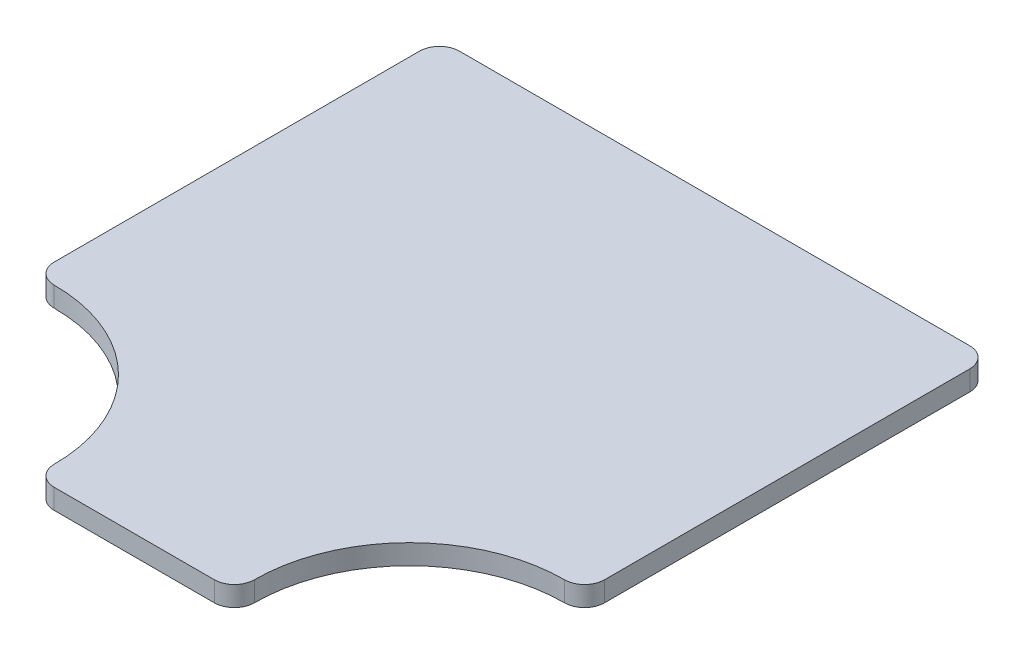
ISO-10303-21;
HEADER;
FILE_DESCRIPTION(('STEP AP214'),'2;1');
FILE_NAME('part.step','',(''),(''),'','','');
FILE_SCHEMA(('AUTOMOTIVE_DESIGN { 1 0 10303 214 1 1 1 1 }'));
ENDSEC;
DATA;
#1=APPLICATION_CONTEXT('core data for automotive mechanical design processes');
#2=APPLICATION_PROTOCOL_DEFINITION('international standard','automotive_design',2000,#1);
#3=PRODUCT_CONTEXT('',#1,'mechanical');
#4=PRODUCT('Part','Part','',(#3));
#5=PRODUCT_RELATED_PRODUCT_CATEGORY('part','',(#4));
#6=PRODUCT_DEFINITION_FORMATION('','',#4);
#7=PRODUCT_DEFINITION_CONTEXT('part definition',#1,'design');
#8=PRODUCT_DEFINITION('design','',#6,#7);
#9=PRODUCT_DEFINITION_SHAPE('','',#8);
#10=(LENGTH_UNIT() NAMED_UNIT(*) SI_UNIT(.MILLI.,.METRE.));
#11=(NAMED_UNIT(*) PLANE_ANGLE_UNIT() SI_UNIT($,.RADIAN.));
#12=(NAMED_UNIT(*) SI_UNIT($,.STERADIAN.) SOLID_ANGLE_UNIT());
#13=UNCERTAINTY_MEASURE_WITH_UNIT(LENGTH_MEASURE(1.E-05),#10,'distance_accuracy_value','');
#14=(GEOMETRIC_REPRESENTATION_CONTEXT(3) GLOBAL_UNCERTAINTY_ASSIGNED_CONTEXT((#13)) GLOBAL_UNIT_ASSIGNED_CONTEXT((#10,
#11,#12)) REPRESENTATION_CONTEXT('',''));
#15=CARTESIAN_POINT('',(0.,0.,0.));
#16=DIRECTION('',(0.,0.,1.));
#17=DIRECTION('',(1.,0.,0.));
#18=AXIS2_PLACEMENT_3D('',#15,#16,#17);
#19=CARTESIAN_POINT('',(-41.5283816425121,2.,-2.69220383256537));
#20=DIRECTION('',(0.,-1.,0.));
#21=DIRECTION('',(0.,0.,-1.));
#22=AXIS2_PLACEMENT_3D('',#19,#20,#21);
#23=CYLINDRICAL_SURFACE('',#22,2.);
#24=CARTESIAN_POINT('',(-41.5283816425121,0.,-2.69220383256537));
#25=DIRECTION('',(0.,1.,0.));
#26=DIRECTION('',(0.,0.,1.));
#27=AXIS2_PLACEMENT_3D('',#24,#25,#26);
#28=CIRCLE('',#27,2.);
#29=CARTESIAN_POINT('',(-43.5283816425121,0.,-2.69220383256537));
#30=VERTEX_POINT('',#29);
#31=CARTESIAN_POINT('',(-41.5283816425121,0.,-0.692203832565375));
#32=VERTEX_POINT('',#31);
#33=EDGE_CURVE('E152',#30,#32,#28,.T.);
#34=ORIENTED_EDGE('',*,*,#33,.T.);
#35=DIRECTION('',(0.,-1.,0.));
#36=VECTOR('',#35,1.);
#37=CARTESIAN_POINT('',(-41.5283816425121,2.,-0.692203832565375));
#38=LINE('',#37,#36);
#39=CARTESIAN_POINT('',(-41.5283816425121,2.,-0.692203832565375));
#40=VERTEX_POINT('',#39);
#41=EDGE_CURVE('E11',#40,#32,#38,.T.);
#42=ORIENTED_EDGE('',*,*,#41,.F.);
#43=CARTESIAN_POINT('',(-41.5283816425121,2.,-2.69220383256537));
#44=DIRECTION('',(0.,1.,0.));
#45=DIRECTION('',(0.,0.,1.));
#46=AXIS2_PLACEMENT_3D('',#43,#44,#45);
#47=CIRCLE('',#46,2.);
#48=CARTESIAN_POINT('',(-43.5283816425121,2.,-2.69220383256537));
#49=VERTEX_POINT('',#48);
#50=EDGE_CURVE('E174',#49,#40,#47,.T.);
#51=ORIENTED_EDGE('',*,*,#50,.F.);
#52=DIRECTION('',(0.,-1.,0.));
#53=VECTOR('',#52,1.);
#54=CARTESIAN_POINT('',(-43.5283816425121,2.,-2.69220383256537));
#55=LINE('',#54,#53);
#56=EDGE_CURVE('E148',#49,#30,#55,.T.);
#57=ORIENTED_EDGE('',*,*,#56,.T.);
#58=EDGE_LOOP('',(#34,#42,#51,#57));
#59=FACE_BOUND('',#58,.T.);
#60=ADVANCED_FACE('F32',(#59),#23,.T.);
#61=CARTESIAN_POINT('',(-41.5283816425121,2.,14.8077961674346));
#62=DIRECTION('',(0.,-1.,0.));
#63=DIRECTION('',(0.,0.,-1.));
#64=AXIS2_PLACEMENT_3D('',#61,#62,#63);
#65=CYLINDRICAL_SURFACE('',#64,15.5);
#66=CARTESIAN_POINT('',(-41.5283816425121,0.,14.8077961674346));
#67=DIRECTION('',(0.,-1.,0.));
#68=DIRECTION('',(0.,0.,1.));
#69=AXIS2_PLACEMENT_3D('',#66,#67,#68);
#70=CIRCLE('',#69,15.5);
#71=CARTESIAN_POINT('',(-26.0283816425121,0.,14.8077961674346));
#72=VERTEX_POINT('',#71);
#73=EDGE_CURVE('E155',#32,#72,#70,.T.);
#74=ORIENTED_EDGE('',*,*,#73,.T.);
#75=DIRECTION('',(0.,-1.,0.));
#76=VECTOR('',#75,1.);
#77=CARTESIAN_POINT('',(-26.0283816425121,2.,14.8077961674346));
#78=LINE('',#77,#76);
#79=CARTESIAN_POINT('',(-26.0283816425121,2.,14.8077961674346));
#80=VERTEX_POINT('',#79);
#81=EDGE_CURVE('E40',#80,#72,#78,.T.);
#82=ORIENTED_EDGE('',*,*,#81,.F.);
#83=CARTESIAN_POINT('',(-41.5283816425121,2.,14.8077961674346));
#84=DIRECTION('',(0.,-1.,0.));
#85=DIRECTION('',(0.,0.,1.));
#86=AXIS2_PLACEMENT_3D('',#83,#84,#85);
#87=CIRCLE('',#86,15.5);
#88=EDGE_CURVE('E103',#40,#80,#87,.T.);
#89=ORIENTED_EDGE('',*,*,#88,.F.);
#90=ORIENTED_EDGE('',*,*,#41,.T.);
#91=EDGE_LOOP('',(#74,#82,#89,#90));
#92=FACE_BOUND('',#91,.T.);
#93=ADVANCED_FACE('F252',(#92),#65,.F.);
#94=CARTESIAN_POINT('',(-24.0283816425121,2.,14.8077961674346));
#95=DIRECTION('',(0.,-1.,0.));
#96=DIRECTION('',(0.,0.,-1.));
#97=AXIS2_PLACEMENT_3D('',#94,#95,#96);
#98=CYLINDRICAL_SURFACE('',#97,2.);
#99=CARTESIAN_POINT('',(-24.0283816425121,0.,14.8077961674346));
#100=DIRECTION('',(0.,1.,0.));
#101=DIRECTION('',(0.,0.,1.));
#102=AXIS2_PLACEMENT_3D('',#99,#100,#101);
#103=CIRCLE('',#102,2.);
#104=CARTESIAN_POINT('',(-24.0283816425121,0.,16.8077961674346));
#105=VERTEX_POINT('',#104);
#106=EDGE_CURVE('E157',#72,#105,#103,.T.);
#107=ORIENTED_EDGE('',*,*,#106,.T.);
#108=DIRECTION('',(0.,-1.,0.));
#109=VECTOR('',#108,1.);
#110=CARTESIAN_POINT('',(-24.0283816425121,2.,16.8077961674346));
#111=LINE('',#110,#109);
#112=CARTESIAN_POINT('',(-24.0283816425121,2.,16.8077961674346));
#113=VERTEX_POINT('',#112);
#114=EDGE_CURVE('E193',#113,#105,#111,.T.);
#115=ORIENTED_EDGE('',*,*,#114,.F.);
#116=CARTESIAN_POINT('',(-24.0283816425121,2.,14.8077961674346));
#117=DIRECTION('',(0.,1.,0.));
#118=DIRECTION('',(0.,0.,1.));
#119=AXIS2_PLACEMENT_3D('',#116,#117,#118);
#120=CIRCLE('',#119,2.);
#121=EDGE_CURVE('E201',#80,#113,#120,.T.);
#122=ORIENTED_EDGE('',*,*,#121,.F.);
#123=ORIENTED_EDGE('',*,*,#81,.T.);
#124=EDGE_LOOP('',(#107,#115,#122,#123));
#125=FACE_BOUND('',#124,.T.);
#126=ADVANCED_FACE('F199',(#125),#98,.T.);
#127=CARTESIAN_POINT('',(-24.0283816425121,2.,16.8077961674346));
#128=DIRECTION('',(0.,0.,-1.));
#129=DIRECTION('',(-1.,0.,0.));
#130=AXIS2_PLACEMENT_3D('',#127,#128,#129);
#131=PLANE('',#130);
#132=DIRECTION('',(1.,0.,0.));
#133=VECTOR('',#132,1.);
#134=CARTESIAN_POINT('',(-24.0283816425121,0.,16.8077961674346));
#135=LINE('',#134,#133);
#136=CARTESIAN_POINT('',(-8.02838164251207,0.,16.8077961674346));
#137=VERTEX_POINT('',#136);
#138=EDGE_CURVE('E159',#105,#137,#135,.T.);
#139=ORIENTED_EDGE('',*,*,#138,.T.);
#140=DIRECTION('',(0.,-1.,0.));
#141=VECTOR('',#140,1.);
#142=CARTESIAN_POINT('',(-8.02838164251207,2.,16.8077961674346));
#143=LINE('',#142,#141);
#144=CARTESIAN_POINT('',(-8.02838164251207,2.,16.8077961674346));
#145=VERTEX_POINT('',#144);
#146=EDGE_CURVE('E190',#145,#137,#143,.T.);
#147=ORIENTED_EDGE('',*,*,#146,.F.);
#148=DIRECTION('',(1.,0.,0.));
#149=VECTOR('',#148,1.);
#150=CARTESIAN_POINT('',(-24.0283816425121,2.,16.8077961674346));
#151=LINE('',#150,#149);
#152=EDGE_CURVE('E219',#113,#145,#151,.T.);
#153=ORIENTED_EDGE('',*,*,#152,.F.);
#154=ORIENTED_EDGE('',*,*,#114,.T.);
#155=EDGE_LOOP('',(#139,#147,#153,#154));
#156=FACE_BOUND('',#155,.T.);
#157=ADVANCED_FACE('F210',(#156),#131,.F.);
#158=CARTESIAN_POINT('',(-8.02838164251207,2.,14.8077961674346));
#159=DIRECTION('',(0.,-1.,0.));
#160=DIRECTION('',(0.,0.,-1.));
#161=AXIS2_PLACEMENT_3D('',#158,#159,#160);
#162=CYLINDRICAL_SURFACE('',#161,2.);
#163=CARTESIAN_POINT('',(-8.02838164251207,0.,14.8077961674346));
#164=DIRECTION('',(0.,1.,0.));
#165=DIRECTION('',(0.,0.,-1.));
#166=AXIS2_PLACEMENT_3D('',#163,#164,#165);
#167=CIRCLE('',#166,2.);
#168=CARTESIAN_POINT('',(-6.02838164251207,0.,14.8077961674346));
#169=VERTEX_POINT('',#168);
#170=EDGE_CURVE('E161',#137,#169,#167,.T.);
#171=ORIENTED_EDGE('',*,*,#170,.T.);
#172=DIRECTION('',(0.,-1.,0.));
#173=VECTOR('',#172,1.);
#174=CARTESIAN_POINT('',(-6.02838164251207,2.,14.8077961674346));
#175=LINE('',#174,#173);
#176=CARTESIAN_POINT('',(-6.02838164251207,2.,14.8077961674346));
#177=VERTEX_POINT('',#176);
#178=EDGE_CURVE('E187',#177,#169,#175,.T.);
#179=ORIENTED_EDGE('',*,*,#178,.F.);
#180=CARTESIAN_POINT('',(-8.02838164251207,2.,14.8077961674346));
#181=DIRECTION('',(0.,1.,0.));
#182=DIRECTION('',(0.,0.,-1.));
#183=AXIS2_PLACEMENT_3D('',#180,#181,#182);
#184=CIRCLE('',#183,2.);
#185=EDGE_CURVE('E216',#145,#177,#184,.T.);
#186=ORIENTED_EDGE('',*,*,#185,.F.);
#187=ORIENTED_EDGE('',*,*,#146,.T.);
#188=EDGE_LOOP('',(#171,#179,#186,#187));
#189=FACE_BOUND('',#188,.T.);
#190=ADVANCED_FACE('F214',(#189),#162,.T.);
#191=CARTESIAN_POINT('',(9.47161835748792,2.,14.8077961674346));
#192=DIRECTION('',(0.,-1.,0.));
#193=DIRECTION('',(0.,0.,-1.));
#194=AXIS2_PLACEMENT_3D('',#191,#192,#193);
#195=CYLINDRICAL_SURFACE('',#194,15.5);
#196=CARTESIAN_POINT('',(9.47161835748792,0.,14.8077961674346));
#197=DIRECTION('',(0.,-1.,0.));
#198=DIRECTION('',(0.,0.,1.));
#199=AXIS2_PLACEMENT_3D('',#196,#197,#198);
#200=CIRCLE('',#199,15.5);
#201=CARTESIAN_POINT('',(9.47161835748792,0.,-0.692203832565397));
#202=VERTEX_POINT('',#201);
#203=EDGE_CURVE('E163',#169,#202,#200,.T.);
#204=ORIENTED_EDGE('',*,*,#203,.T.);
#205=DIRECTION('',(0.,-1.,0.));
#206=VECTOR('',#205,1.);
#207=CARTESIAN_POINT('',(9.47161835748792,2.,-0.692203832565397));
#208=LINE('',#207,#206);
#209=CARTESIAN_POINT('',(9.47161835748792,2.,-0.692203832565397));
#210=VERTEX_POINT('',#209);
#211=EDGE_CURVE('E184',#210,#202,#208,.T.);
#212=ORIENTED_EDGE('',*,*,#211,.F.);
#213=CARTESIAN_POINT('',(9.47161835748792,2.,14.8077961674346));
#214=DIRECTION('',(0.,-1.,0.));
#215=DIRECTION('',(0.,0.,1.));
#216=AXIS2_PLACEMENT_3D('',#213,#214,#215);
#217=CIRCLE('',#216,15.5);
#218=EDGE_CURVE('E218',#177,#210,#217,.T.);
#219=ORIENTED_EDGE('',*,*,#218,.F.);
#220=ORIENTED_EDGE('',*,*,#178,.T.);
#221=EDGE_LOOP('',(#204,#212,#219,#220));
#222=FACE_BOUND('',#221,.T.);
#223=ADVANCED_FACE('F265',(#222),#195,.F.);
#224=CARTESIAN_POINT('',(9.47161835748792,2.,-2.6922038325654));
#225=DIRECTION('',(0.,-1.,0.));
#226=DIRECTION('',(0.,0.,-1.));
#227=AXIS2_PLACEMENT_3D('',#224,#225,#226);
#228=CYLINDRICAL_SURFACE('',#227,2.);
#229=CARTESIAN_POINT('',(9.47161835748792,0.,-2.6922038325654));
#230=DIRECTION('',(0.,1.,0.));
#231=DIRECTION('',(0.,0.,-1.));
#232=AXIS2_PLACEMENT_3D('',#229,#230,#231);
#233=CIRCLE('',#232,2.);
#234=CARTESIAN_POINT('',(11.4716183574879,0.,-2.6922038325654));
#235=VERTEX_POINT('',#234);
#236=EDGE_CURVE('E165',#202,#235,#233,.T.);
#237=ORIENTED_EDGE('',*,*,#236,.T.);
#238=DIRECTION('',(0.,-1.,0.));
#239=VECTOR('',#238,1.);
#240=CARTESIAN_POINT('',(11.4716183574879,2.,-2.6922038325654));
#241=LINE('',#240,#239);
#242=CARTESIAN_POINT('',(11.4716183574879,2.,-2.6922038325654));
#243=VERTEX_POINT('',#242);
#244=EDGE_CURVE('E181',#243,#235,#241,.T.);
#245=ORIENTED_EDGE('',*,*,#244,.F.);
#246=CARTESIAN_POINT('',(9.47161835748792,2.,-2.6922038325654));
#247=DIRECTION('',(0.,1.,0.));
#248=DIRECTION('',(0.,0.,-1.));
#249=AXIS2_PLACEMENT_3D('',#246,#247,#248);
#250=CIRCLE('',#249,2.);
#251=EDGE_CURVE('E221',#210,#243,#250,.T.);
#252=ORIENTED_EDGE('',*,*,#251,.F.);
#253=ORIENTED_EDGE('',*,*,#211,.T.);
#254=EDGE_LOOP('',(#237,#245,#252,#253));
#255=FACE_BOUND('',#254,.T.);
#256=ADVANCED_FACE('F268',(#255),#228,.T.);
#257=CARTESIAN_POINT('',(11.4716183574879,2.,-39.1922038325654));
#258=DIRECTION('',(-1.,0.,0.));
#259=DIRECTION('',(0.,0.,1.));
#260=AXIS2_PLACEMENT_3D('',#257,#258,#259);
#261=PLANE('',#260);
#262=DIRECTION('',(0.,0.,-1.));
#263=VECTOR('',#262,1.);
#264=CARTESIAN_POINT('',(11.4716183574879,0.,-39.1922038325654));
#265=LINE('',#264,#263);
#266=CARTESIAN_POINT('',(11.4716183574879,0.,-39.1922038325654));
#267=VERTEX_POINT('',#266);
#268=EDGE_CURVE('E167',#235,#267,#265,.T.);
#269=ORIENTED_EDGE('',*,*,#268,.T.);
#270=DIRECTION('',(0.,-1.,0.));
#271=VECTOR('',#270,1.);
#272=CARTESIAN_POINT('',(11.4716183574879,2.,-39.1922038325654));
#273=LINE('',#272,#271);
#274=CARTESIAN_POINT('',(11.4716183574879,2.,-39.1922038325654));
#275=VERTEX_POINT('',#274);
#276=EDGE_CURVE('E178',#275,#267,#273,.T.);
#277=ORIENTED_EDGE('',*,*,#276,.F.);
#278=DIRECTION('',(0.,0.,-1.));
#279=VECTOR('',#278,1.);
#280=CARTESIAN_POINT('',(11.4716183574879,2.,-39.1922038325654));
#281=LINE('',#280,#279);
#282=EDGE_CURVE('E227',#243,#275,#281,.T.);
#283=ORIENTED_EDGE('',*,*,#282,.F.);
#284=ORIENTED_EDGE('',*,*,#244,.T.);
#285=EDGE_LOOP('',(#269,#277,#283,#284));
#286=FACE_BOUND('',#285,.T.);
#287=ADVANCED_FACE('F233',(#286),#261,.F.);
#288=CARTESIAN_POINT('',(9.47161835748792,2.,-39.1922038325654));
#289=DIRECTION('',(0.,-1.,0.));
#290=DIRECTION('',(0.,0.,-1.));
#291=AXIS2_PLACEMENT_3D('',#288,#289,#290);
#292=CYLINDRICAL_SURFACE('',#291,2.);
#293=CARTESIAN_POINT('',(9.47161835748792,0.,-39.1922038325654));
#294=DIRECTION('',(0.,1.,0.));
#295=DIRECTION('',(0.,0.,1.));
#296=AXIS2_PLACEMENT_3D('',#293,#294,#295);
#297=CIRCLE('',#296,2.);
#298=CARTESIAN_POINT('',(9.4716183574879,0.,-41.1922038325654));
#299=VERTEX_POINT('',#298);
#300=EDGE_CURVE('E169',#267,#299,#297,.T.);
#301=ORIENTED_EDGE('',*,*,#300,.T.);
#302=DIRECTION('',(0.,-1.,0.));
#303=VECTOR('',#302,1.);
#304=CARTESIAN_POINT('',(9.4716183574879,2.,-41.1922038325654));
#305=LINE('',#304,#303);
#306=CARTESIAN_POINT('',(9.4716183574879,2.,-41.1922038325654));
#307=VERTEX_POINT('',#306);
#308=EDGE_CURVE('E143',#307,#299,#305,.T.);
#309=ORIENTED_EDGE('',*,*,#308,.F.);
#310=CARTESIAN_POINT('',(9.47161835748792,2.,-39.1922038325654));
#311=DIRECTION('',(0.,1.,0.));
#312=DIRECTION('',(0.,0.,1.));
#313=AXIS2_PLACEMENT_3D('',#310,#311,#312);
#314=CIRCLE('',#313,2.);
#315=EDGE_CURVE('E134',#275,#307,#314,.T.);
#316=ORIENTED_EDGE('',*,*,#315,.F.);
#317=ORIENTED_EDGE('',*,*,#276,.T.);
#318=EDGE_LOOP('',(#301,#309,#316,#317));
#319=FACE_BOUND('',#318,.T.);
#320=ADVANCED_FACE('F237',(#319),#292,.T.);
#321=CARTESIAN_POINT('',(-41.5283816425121,2.,-41.1922038325654));
#322=DIRECTION('',(0.,0.,1.));
#323=DIRECTION('',(1.,0.,0.));
#324=AXIS2_PLACEMENT_3D('',#321,#322,#323);
#325=PLANE('',#324);
#326=DIRECTION('',(-1.,0.,0.));
#327=VECTOR('',#326,1.);
#328=CARTESIAN_POINT('',(-41.5283816425121,0.,-41.1922038325654));
#329=LINE('',#328,#327);
#330=CARTESIAN_POINT('',(-41.5283816425121,0.,-41.1922038325654));
#331=VERTEX_POINT('',#330);
#332=EDGE_CURVE('E142',#299,#331,#329,.T.);
#333=ORIENTED_EDGE('',*,*,#332,.T.);
#334=DIRECTION('',(0.,-1.,0.));
#335=VECTOR('',#334,1.);
#336=CARTESIAN_POINT('',(-41.5283816425121,2.,-41.1922038325654));
#337=LINE('',#336,#335);
#338=CARTESIAN_POINT('',(-41.5283816425121,2.,-41.1922038325654));
#339=VERTEX_POINT('',#338);
#340=EDGE_CURVE('E139',#339,#331,#337,.T.);
#341=ORIENTED_EDGE('',*,*,#340,.F.);
#342=DIRECTION('',(-1.,0.,0.));
#343=VECTOR('',#342,1.);
#344=CARTESIAN_POINT('',(-41.5283816425121,2.,-41.1922038325654));
#345=LINE('',#344,#343);
#346=EDGE_CURVE('E128',#307,#339,#345,.T.);
#347=ORIENTED_EDGE('',*,*,#346,.F.);
#348=ORIENTED_EDGE('',*,*,#308,.T.);
#349=EDGE_LOOP('',(#333,#341,#347,#348));
#350=FACE_BOUND('',#349,.T.);
#351=ADVANCED_FACE('F140',(#350),#325,.F.);
#352=CARTESIAN_POINT('',(-41.5283816425121,2.,-39.1922038325654));
#353=DIRECTION('',(0.,-1.,0.));
#354=DIRECTION('',(0.,0.,-1.));
#355=AXIS2_PLACEMENT_3D('',#352,#353,#354);
#356=CYLINDRICAL_SURFACE('',#355,2.);
#357=CARTESIAN_POINT('',(-41.5283816425121,0.,-39.1922038325654));
#358=DIRECTION('',(0.,1.,0.));
#359=DIRECTION('',(0.,0.,1.));
#360=AXIS2_PLACEMENT_3D('',#357,#358,#359);
#361=CIRCLE('',#360,2.);
#362=CARTESIAN_POINT('',(-43.5283816425121,0.,-39.1922038325654));
#363=VERTEX_POINT('',#362);
#364=EDGE_CURVE('E89',#331,#363,#361,.T.);
#365=ORIENTED_EDGE('',*,*,#364,.T.);
#366=DIRECTION('',(0.,-1.,0.));
#367=VECTOR('',#366,1.);
#368=CARTESIAN_POINT('',(-43.5283816425121,2.,-39.1922038325654));
#369=LINE('',#368,#367);
#370=CARTESIAN_POINT('',(-43.5283816425121,2.,-39.1922038325654));
#371=VERTEX_POINT('',#370);
#372=EDGE_CURVE('E144',#371,#363,#369,.T.);
#373=ORIENTED_EDGE('',*,*,#372,.F.);
#374=CARTESIAN_POINT('',(-41.5283816425121,2.,-39.1922038325654));
#375=DIRECTION('',(0.,1.,0.));
#376=DIRECTION('',(0.,0.,1.));
#377=AXIS2_PLACEMENT_3D('',#374,#375,#376);
#378=CIRCLE('',#377,2.);
#379=EDGE_CURVE('E132',#339,#371,#378,.T.);
#380=ORIENTED_EDGE('',*,*,#379,.F.);
#381=ORIENTED_EDGE('',*,*,#340,.T.);
#382=EDGE_LOOP('',(#365,#373,#380,#381));
#383=FACE_BOUND('',#382,.T.);
#384=ADVANCED_FACE('F146',(#383),#356,.T.);
#385=CARTESIAN_POINT('',(-43.5283816425121,2.,-39.1922038325654));
#386=DIRECTION('',(1.,0.,0.));
#387=DIRECTION('',(0.,0.,-1.));
#388=AXIS2_PLACEMENT_3D('',#385,#386,#387);
#389=PLANE('',#388);
#390=DIRECTION('',(0.,0.,1.));
#391=VECTOR('',#390,1.);
#392=CARTESIAN_POINT('',(-43.5283816425121,0.,-39.1922038325654));
#393=LINE('',#392,#391);
#394=EDGE_CURVE('E95',#363,#30,#393,.T.);
#395=ORIENTED_EDGE('',*,*,#394,.T.);
#396=ORIENTED_EDGE('',*,*,#56,.F.);
#397=DIRECTION('',(0.,0.,1.));
#398=VECTOR('',#397,1.);
#399=CARTESIAN_POINT('',(-43.5283816425121,2.,-39.1922038325654));
#400=LINE('',#399,#398);
#401=EDGE_CURVE('E48',#371,#49,#400,.T.);
#402=ORIENTED_EDGE('',*,*,#401,.F.);
#403=ORIENTED_EDGE('',*,*,#372,.T.);
#404=EDGE_LOOP('',(#395,#396,#402,#403));
#405=FACE_BOUND('',#404,.T.);
#406=ADVANCED_FACE('F241',(#405),#389,.F.);
#407=CARTESIAN_POINT('',(-41.5283816425121,2.,-2.69220383256537));
#408=DIRECTION('',(0.,1.,0.));
#409=DIRECTION('',(0.,0.,1.));
#410=AXIS2_PLACEMENT_3D('',#407,#408,#409);
#411=PLANE('',#410);
#412=ORIENTED_EDGE('',*,*,#50,.T.);
#413=ORIENTED_EDGE('',*,*,#88,.T.);
#414=ORIENTED_EDGE('',*,*,#121,.T.);
#415=ORIENTED_EDGE('',*,*,#152,.T.);
#416=ORIENTED_EDGE('',*,*,#185,.T.);
#417=ORIENTED_EDGE('',*,*,#218,.T.);
#418=ORIENTED_EDGE('',*,*,#251,.T.);
#419=ORIENTED_EDGE('',*,*,#282,.T.);
#420=ORIENTED_EDGE('',*,*,#315,.T.);
#421=ORIENTED_EDGE('',*,*,#346,.T.);
#422=ORIENTED_EDGE('',*,*,#379,.T.);
#423=ORIENTED_EDGE('',*,*,#401,.T.);
#424=EDGE_LOOP('',(#412,#413,#414,#415,#416,#417,#418,#419,#420,#421,#422,#423));
#425=FACE_BOUND('',#424,.T.);
#426=ADVANCED_FACE('F130',(#425),#411,.T.);
#427=CARTESIAN_POINT('',(-41.5283816425121,0.,-2.69220383256537));
#428=DIRECTION('',(0.,1.,0.));
#429=DIRECTION('',(0.,0.,1.));
#430=AXIS2_PLACEMENT_3D('',#427,#428,#429);
#431=PLANE('',#430);
#432=ORIENTED_EDGE('',*,*,#33,.F.);
#433=ORIENTED_EDGE('',*,*,#394,.F.);
#434=ORIENTED_EDGE('',*,*,#364,.F.);
#435=ORIENTED_EDGE('',*,*,#332,.F.);
#436=ORIENTED_EDGE('',*,*,#300,.F.);
#437=ORIENTED_EDGE('',*,*,#268,.F.);
#438=ORIENTED_EDGE('',*,*,#236,.F.);
#439=ORIENTED_EDGE('',*,*,#203,.F.);
#440=ORIENTED_EDGE('',*,*,#170,.F.);
#441=ORIENTED_EDGE('',*,*,#138,.F.);
#442=ORIENTED_EDGE('',*,*,#106,.F.);
#443=ORIENTED_EDGE('',*,*,#73,.F.);
#444=EDGE_LOOP('',(#432,#433,#434,#435,#436,#437,#438,#439,#440,#441,#442,#443));
#445=FACE_BOUND('',#444,.T.);
#446=ADVANCED_FACE('F205',(#445),#431,.F.);
#447=CLOSED_SHELL('',(#60,#93,#126,#157,#190,#223,#256,#287,#320,#351,#384,#406,#426,#446));
#448=MANIFOLD_SOLID_BREP('B2',#447);
#449=ADVANCED_BREP_SHAPE_REPRESENTATION('',(#18,#448),#14);
#450=SHAPE_DEFINITION_REPRESENTATION(#9,#449);
ENDSEC;
END-ISO-10303-21;
